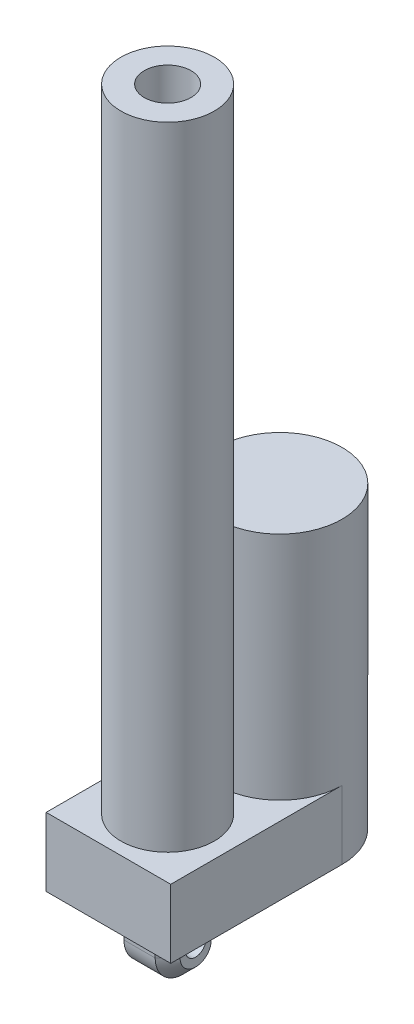
ISO-10303-21;
HEADER;
FILE_DESCRIPTION(('STEP AP214'),'2;1');
FILE_NAME('part.step','',(''),(''),'','','');
FILE_SCHEMA(('AUTOMOTIVE_DESIGN { 1 0 10303 214 1 1 1 1 }'));
ENDSEC;
DATA;
#1=APPLICATION_CONTEXT('core data for automotive mechanical design processes');
#2=APPLICATION_PROTOCOL_DEFINITION('international standard','automotive_design',2000,#1);
#3=PRODUCT_CONTEXT('',#1,'mechanical');
#4=PRODUCT('Part','Part','',(#3));
#5=PRODUCT_RELATED_PRODUCT_CATEGORY('part','',(#4));
#6=PRODUCT_DEFINITION_FORMATION('','',#4);
#7=PRODUCT_DEFINITION_CONTEXT('part definition',#1,'design');
#8=PRODUCT_DEFINITION('design','',#6,#7);
#9=PRODUCT_DEFINITION_SHAPE('','',#8);
#10=(LENGTH_UNIT() NAMED_UNIT(*) SI_UNIT(.MILLI.,.METRE.));
#11=(NAMED_UNIT(*) PLANE_ANGLE_UNIT() SI_UNIT($,.RADIAN.));
#12=(NAMED_UNIT(*) SI_UNIT($,.STERADIAN.) SOLID_ANGLE_UNIT());
#13=UNCERTAINTY_MEASURE_WITH_UNIT(LENGTH_MEASURE(1.E-05),#10,'distance_accuracy_value','');
#14=(GEOMETRIC_REPRESENTATION_CONTEXT(3) GLOBAL_UNCERTAINTY_ASSIGNED_CONTEXT((#13)) GLOBAL_UNIT_ASSIGNED_CONTEXT((#10,
#11,#12)) REPRESENTATION_CONTEXT('',''));
#15=CARTESIAN_POINT('',(0.,0.,0.));
#16=DIRECTION('',(0.,0.,1.));
#17=DIRECTION('',(1.,0.,0.));
#18=AXIS2_PLACEMENT_3D('',#15,#16,#17);
#19=CARTESIAN_POINT('',(-9.,-20.,-0.500000000000004));
#20=DIRECTION('',(0.,0.,1.));
#21=DIRECTION('',(1.,0.,0.));
#22=AXIS2_PLACEMENT_3D('',#19,#20,#21);
#23=PLANE('',#22);
#24=DIRECTION('',(1.,0.,0.));
#25=VECTOR('',#24,1.);
#26=CARTESIAN_POINT('',(-9.,0.,-0.500000000000004));
#27=LINE('',#26,#25);
#28=CARTESIAN_POINT('',(-5.00000000000002,0.,-0.500000000000004));
#29=VERTEX_POINT('',#28);
#30=CARTESIAN_POINT('',(5.,0.,-0.500000000000004));
#31=VERTEX_POINT('',#30);
#32=EDGE_CURVE('E285',#29,#31,#27,.T.);
#33=ORIENTED_EDGE('',*,*,#32,.T.);
#34=DIRECTION('',(0.,-1.,0.));
#35=VECTOR('',#34,1.);
#36=CARTESIAN_POINT('',(5.,-20.,-0.500000000000004));
#37=LINE('',#36,#35);
#38=CARTESIAN_POINT('',(5.,-11.,-0.500000000000004));
#39=VERTEX_POINT('',#38);
#40=EDGE_CURVE('E240',#31,#39,#37,.T.);
#41=ORIENTED_EDGE('',*,*,#40,.T.);
#42=DIRECTION('',(-1.,0.,0.));
#43=VECTOR('',#42,1.);
#44=CARTESIAN_POINT('',(20.,-11.,-0.500000000000004));
#45=LINE('',#44,#43);
#46=CARTESIAN_POINT('',(-5.00000000000002,-11.,-0.500000000000004));
#47=VERTEX_POINT('',#46);
#48=EDGE_CURVE('E273',#39,#47,#45,.T.);
#49=ORIENTED_EDGE('',*,*,#48,.T.);
#50=DIRECTION('',(0.,1.,0.));
#51=VECTOR('',#50,1.);
#52=CARTESIAN_POINT('',(-5.00000000000002,-20.,-0.500000000000004));
#53=LINE('',#52,#51);
#54=EDGE_CURVE('E163',#47,#29,#53,.T.);
#55=ORIENTED_EDGE('',*,*,#54,.T.);
#56=EDGE_LOOP('',(#33,#41,#49,#55));
#57=FACE_BOUND('',#56,.T.);
#58=ADVANCED_FACE('F41',(#57),#23,.F.);
#59=CARTESIAN_POINT('',(0.,0.,-27.5));
#60=DIRECTION('',(0.,1.,0.));
#61=DIRECTION('',(0.,0.,1.));
#62=AXIS2_PLACEMENT_3D('',#59,#60,#61);
#63=PLANE('',#62);
#64=CARTESIAN_POINT('',(0.,0.,-27.5));
#65=DIRECTION('',(0.,1.,0.));
#66=DIRECTION('',(0.,0.,1.));
#67=AXIS2_PLACEMENT_3D('',#64,#65,#66);
#68=CIRCLE('',#67,20.);
#69=CARTESIAN_POINT('',(20.,0.,-27.5));
#70=VERTEX_POINT('',#69);
#71=CARTESIAN_POINT('',(-20.,0.,-27.5));
#72=VERTEX_POINT('',#71);
#73=EDGE_CURVE('E181',#70,#72,#68,.T.);
#74=ORIENTED_EDGE('',*,*,#73,.F.);
#75=DIRECTION('',(0.,0.,-1.));
#76=VECTOR('',#75,1.);
#77=CARTESIAN_POINT('',(20.,0.,27.5));
#78=LINE('',#77,#76);
#79=CARTESIAN_POINT('',(20.,0.,27.5));
#80=VERTEX_POINT('',#79);
#81=EDGE_CURVE('E140',#80,#70,#78,.T.);
#82=ORIENTED_EDGE('',*,*,#81,.F.);
#83=DIRECTION('',(1.,0.,0.));
#84=VECTOR('',#83,1.);
#85=CARTESIAN_POINT('',(-20.,0.,27.5));
#86=LINE('',#85,#84);
#87=CARTESIAN_POINT('',(-20.,0.,27.5));
#88=VERTEX_POINT('',#87);
#89=EDGE_CURVE('E187',#88,#80,#86,.T.);
#90=ORIENTED_EDGE('',*,*,#89,.F.);
#91=DIRECTION('',(0.,0.,1.));
#92=VECTOR('',#91,1.);
#93=CARTESIAN_POINT('',(-20.,0.,27.5));
#94=LINE('',#93,#92);
#95=EDGE_CURVE('E184',#72,#88,#94,.T.);
#96=ORIENTED_EDGE('',*,*,#95,.F.);
#97=EDGE_LOOP('',(#74,#82,#90,#96));
#98=FACE_BOUND('',#97,.T.);
#99=DIRECTION('',(0.,0.,1.));
#100=VECTOR('',#99,1.);
#101=CARTESIAN_POINT('',(9.,0.,-0.500000000000004));
#102=LINE('',#101,#100);
#103=CARTESIAN_POINT('',(9.,0.,3.50000000000003));
#104=VERTEX_POINT('',#103);
#105=CARTESIAN_POINT('',(9.,0.,13.5));
#106=VERTEX_POINT('',#105);
#107=EDGE_CURVE('E267',#104,#106,#102,.T.);
#108=ORIENTED_EDGE('',*,*,#107,.F.);
#109=DIRECTION('',(0.707106781186545,0.,0.70710678118655));
#110=VECTOR('',#109,1.);
#111=CARTESIAN_POINT('',(-11.,0.,-16.5000000000001));
#112=LINE('',#111,#110);
#113=EDGE_CURVE('E52',#104,#31,#112,.F.);
#114=ORIENTED_EDGE('',*,*,#113,.T.);
#115=ORIENTED_EDGE('',*,*,#32,.F.);
#116=DIRECTION('',(0.707106781186548,0.,-0.707106781186548));
#117=VECTOR('',#116,1.);
#118=CARTESIAN_POINT('',(11.,0.,-16.5));
#119=LINE('',#118,#117);
#120=CARTESIAN_POINT('',(-9.,0.,3.49999999999997));
#121=VERTEX_POINT('',#120);
#122=EDGE_CURVE('E213',#29,#121,#119,.F.);
#123=ORIENTED_EDGE('',*,*,#122,.T.);
#124=DIRECTION('',(0.,0.,-1.));
#125=VECTOR('',#124,1.);
#126=CARTESIAN_POINT('',(-9.,0.,-0.500000000000004));
#127=LINE('',#126,#125);
#128=CARTESIAN_POINT('',(-9.,0.,13.5));
#129=VERTEX_POINT('',#128);
#130=EDGE_CURVE('E277',#129,#121,#127,.T.);
#131=ORIENTED_EDGE('',*,*,#130,.F.);
#132=DIRECTION('',(-0.707106781186548,0.,-0.707106781186548));
#133=VECTOR('',#132,1.);
#134=CARTESIAN_POINT('',(-25.,0.,-2.5));
#135=LINE('',#134,#133);
#136=CARTESIAN_POINT('',(-5.00000000000002,0.,17.5));
#137=VERTEX_POINT('',#136);
#138=EDGE_CURVE('E216',#129,#137,#135,.F.);
#139=ORIENTED_EDGE('',*,*,#138,.T.);
#140=DIRECTION('',(-1.,0.,0.));
#141=VECTOR('',#140,1.);
#142=CARTESIAN_POINT('',(-9.,0.,17.5));
#143=LINE('',#142,#141);
#144=CARTESIAN_POINT('',(5.,0.,17.5));
#145=VERTEX_POINT('',#144);
#146=EDGE_CURVE('E268',#145,#137,#143,.T.);
#147=ORIENTED_EDGE('',*,*,#146,.F.);
#148=DIRECTION('',(-0.707106781186545,0.,0.70710678118655));
#149=VECTOR('',#148,1.);
#150=CARTESIAN_POINT('',(25.,0.,-2.50000000000016));
#151=LINE('',#150,#149);
#152=EDGE_CURVE('E11',#145,#106,#151,.F.);
#153=ORIENTED_EDGE('',*,*,#152,.T.);
#154=EDGE_LOOP('',(#108,#114,#115,#123,#131,#139,#147,#153));
#155=FACE_BOUND('',#154,.T.);
#156=ADVANCED_FACE('F266',(#98,#155),#63,.F.);
#157=CARTESIAN_POINT('',(0.,22.,-27.5));
#158=DIRECTION('',(0.,-1.,0.));
#159=DIRECTION('',(0.,0.,-1.));
#160=AXIS2_PLACEMENT_3D('',#157,#158,#159);
#161=CYLINDRICAL_SURFACE('',#160,20.);
#162=ORIENTED_EDGE('',*,*,#73,.T.);
#163=DIRECTION('',(0.,-1.,0.));
#164=VECTOR('',#163,1.);
#165=CARTESIAN_POINT('',(-20.,22.,-27.5));
#166=LINE('',#165,#164);
#167=CARTESIAN_POINT('',(-20.,22.,-27.5));
#168=VERTEX_POINT('',#167);
#169=EDGE_CURVE('E161',#168,#72,#166,.T.);
#170=ORIENTED_EDGE('',*,*,#169,.F.);
#171=CARTESIAN_POINT('',(0.,22.,-27.5));
#172=DIRECTION('',(0.,1.,0.));
#173=DIRECTION('',(0.,0.,1.));
#174=AXIS2_PLACEMENT_3D('',#171,#172,#173);
#175=CIRCLE('',#174,20.);
#176=CARTESIAN_POINT('',(20.,22.,-27.5));
#177=VERTEX_POINT('',#176);
#178=EDGE_CURVE('E150',#168,#177,#175,.T.);
#179=ORIENTED_EDGE('',*,*,#178,.T.);
#180=DIRECTION('',(0.,-1.,0.));
#181=VECTOR('',#180,1.);
#182=CARTESIAN_POINT('',(20.,22.,-27.5));
#183=LINE('',#182,#181);
#184=EDGE_CURVE('E134',#177,#70,#183,.T.);
#185=ORIENTED_EDGE('',*,*,#184,.T.);
#186=EDGE_LOOP('',(#162,#170,#179,#185));
#187=FACE_BOUND('',#186,.T.);
#188=CARTESIAN_POINT('',(0.,96.,-27.5));
#189=DIRECTION('',(0.,1.,0.));
#190=DIRECTION('',(0.,0.,1.));
#191=AXIS2_PLACEMENT_3D('',#188,#189,#190);
#192=CIRCLE('',#191,20.);
#193=CARTESIAN_POINT('',(0.,96.,-7.5));
#194=VERTEX_POINT('',#193);
#195=EDGE_CURVE('E174',#194,#194,#192,.T.);
#196=ORIENTED_EDGE('',*,*,#195,.F.);
#197=EDGE_LOOP('',(#196));
#198=FACE_BOUND('',#197,.T.);
#199=ADVANCED_FACE('F158',(#187,#198),#161,.T.);
#200=CARTESIAN_POINT('',(-20.,22.,27.5));
#201=DIRECTION('',(1.,0.,0.));
#202=DIRECTION('',(0.,0.,-1.));
#203=AXIS2_PLACEMENT_3D('',#200,#201,#202);
#204=PLANE('',#203);
#205=ORIENTED_EDGE('',*,*,#95,.T.);
#206=DIRECTION('',(0.,-1.,0.));
#207=VECTOR('',#206,1.);
#208=CARTESIAN_POINT('',(-20.,22.,27.5));
#209=LINE('',#208,#207);
#210=CARTESIAN_POINT('',(-20.,22.,27.5));
#211=VERTEX_POINT('',#210);
#212=EDGE_CURVE('E170',#211,#88,#209,.T.);
#213=ORIENTED_EDGE('',*,*,#212,.F.);
#214=DIRECTION('',(0.,0.,1.));
#215=VECTOR('',#214,1.);
#216=CARTESIAN_POINT('',(-20.,22.,27.5));
#217=LINE('',#216,#215);
#218=EDGE_CURVE('E176',#168,#211,#217,.T.);
#219=ORIENTED_EDGE('',*,*,#218,.F.);
#220=ORIENTED_EDGE('',*,*,#169,.T.);
#221=EDGE_LOOP('',(#205,#213,#219,#220));
#222=FACE_BOUND('',#221,.T.);
#223=ADVANCED_FACE('F494',(#222),#204,.F.);
#224=CARTESIAN_POINT('',(-20.,22.,27.5));
#225=DIRECTION('',(0.,0.,-1.));
#226=DIRECTION('',(-1.,0.,0.));
#227=AXIS2_PLACEMENT_3D('',#224,#225,#226);
#228=PLANE('',#227);
#229=ORIENTED_EDGE('',*,*,#89,.T.);
#230=DIRECTION('',(0.,-1.,0.));
#231=VECTOR('',#230,1.);
#232=CARTESIAN_POINT('',(20.,22.,27.5));
#233=LINE('',#232,#231);
#234=CARTESIAN_POINT('',(20.,22.,27.5));
#235=VERTEX_POINT('',#234);
#236=EDGE_CURVE('E146',#235,#80,#233,.T.);
#237=ORIENTED_EDGE('',*,*,#236,.F.);
#238=DIRECTION('',(1.,0.,0.));
#239=VECTOR('',#238,1.);
#240=CARTESIAN_POINT('',(-20.,22.,27.5));
#241=LINE('',#240,#239);
#242=EDGE_CURVE('E153',#211,#235,#241,.T.);
#243=ORIENTED_EDGE('',*,*,#242,.F.);
#244=ORIENTED_EDGE('',*,*,#212,.T.);
#245=EDGE_LOOP('',(#229,#237,#243,#244));
#246=FACE_BOUND('',#245,.T.);
#247=ADVANCED_FACE('F316',(#246),#228,.F.);
#248=CARTESIAN_POINT('',(20.,22.,27.5));
#249=DIRECTION('',(-1.,0.,0.));
#250=DIRECTION('',(0.,0.,1.));
#251=AXIS2_PLACEMENT_3D('',#248,#249,#250);
#252=PLANE('',#251);
#253=ORIENTED_EDGE('',*,*,#81,.T.);
#254=ORIENTED_EDGE('',*,*,#184,.F.);
#255=DIRECTION('',(0.,0.,-1.));
#256=VECTOR('',#255,1.);
#257=CARTESIAN_POINT('',(20.,22.,27.5));
#258=LINE('',#257,#256);
#259=EDGE_CURVE('E138',#235,#177,#258,.T.);
#260=ORIENTED_EDGE('',*,*,#259,.F.);
#261=ORIENTED_EDGE('',*,*,#236,.T.);
#262=EDGE_LOOP('',(#253,#254,#260,#261));
#263=FACE_BOUND('',#262,.T.);
#264=ADVANCED_FACE('F136',(#263),#252,.F.);
#265=CARTESIAN_POINT('',(0.,22.,-27.5));
#266=DIRECTION('',(0.,1.,0.));
#267=DIRECTION('',(0.,0.,1.));
#268=AXIS2_PLACEMENT_3D('',#265,#266,#267);
#269=PLANE('',#268);
#270=CARTESIAN_POINT('',(0.,22.,8.5));
#271=DIRECTION('',(0.,1.,0.));
#272=DIRECTION('',(0.,0.,1.));
#273=AXIS2_PLACEMENT_3D('',#270,#271,#272);
#274=CIRCLE('',#273,15.);
#275=CARTESIAN_POINT('',(0.,22.,-6.5));
#276=VERTEX_POINT('',#275);
#277=EDGE_CURVE('E294',#276,#276,#274,.T.);
#278=ORIENTED_EDGE('',*,*,#277,.F.);
#279=EDGE_LOOP('',(#278));
#280=FACE_BOUND('',#279,.T.);
#281=ORIENTED_EDGE('',*,*,#178,.F.);
#282=ORIENTED_EDGE('',*,*,#218,.T.);
#283=ORIENTED_EDGE('',*,*,#242,.T.);
#284=ORIENTED_EDGE('',*,*,#259,.T.);
#285=EDGE_LOOP('',(#281,#282,#283,#284));
#286=FACE_BOUND('',#285,.T.);
#287=ADVANCED_FACE('F149',(#280,#286),#269,.T.);
#288=CARTESIAN_POINT('',(0.,96.,-27.5));
#289=DIRECTION('',(0.,1.,0.));
#290=DIRECTION('',(0.,0.,1.));
#291=AXIS2_PLACEMENT_3D('',#288,#289,#290);
#292=PLANE('',#291);
#293=ORIENTED_EDGE('',*,*,#195,.T.);
#294=EDGE_LOOP('',(#293));
#295=FACE_BOUND('',#294,.T.);
#296=ADVANCED_FACE('F308',(#295),#292,.T.);
#297=CARTESIAN_POINT('',(0.,225.,8.5));
#298=DIRECTION('',(0.,-1.,0.));
#299=DIRECTION('',(0.,0.,-1.));
#300=AXIS2_PLACEMENT_3D('',#297,#298,#299);
#301=CYLINDRICAL_SURFACE('',#300,15.);
#302=CARTESIAN_POINT('',(0.,225.,8.5));
#303=DIRECTION('',(0.,1.,0.));
#304=DIRECTION('',(0.,0.,1.));
#305=AXIS2_PLACEMENT_3D('',#302,#303,#304);
#306=CIRCLE('',#305,15.);
#307=CARTESIAN_POINT('',(0.,225.,-6.5));
#308=VERTEX_POINT('',#307);
#309=EDGE_CURVE('E298',#308,#308,#306,.T.);
#310=CARTESIAN_POINT('',(0.,225.,-6.5));
#311=CARTESIAN_POINT('',(0.,222.885416666667,-6.5));
#312=CARTESIAN_POINT('',(0.,220.770833333333,-6.5));
#313=CARTESIAN_POINT('',(0.,216.541666666667,-6.5));
#314=CARTESIAN_POINT('',(0.,214.427083333333,-6.5));
#315=CARTESIAN_POINT('',(0.,210.197916666667,-6.5));
#316=CARTESIAN_POINT('',(0.,208.083333333333,-6.5));
#317=CARTESIAN_POINT('',(0.,203.854166666667,-6.5));
#318=CARTESIAN_POINT('',(0.,201.739583333333,-6.5));
#319=CARTESIAN_POINT('',(0.,197.510416666667,-6.5));
#320=CARTESIAN_POINT('',(0.,195.395833333333,-6.5));
#321=CARTESIAN_POINT('',(0.,191.166666666667,-6.5));
#322=CARTESIAN_POINT('',(0.,189.052083333333,-6.5));
#323=CARTESIAN_POINT('',(0.,184.822916666667,-6.5));
#324=CARTESIAN_POINT('',(0.,182.708333333333,-6.5));
#325=CARTESIAN_POINT('',(0.,178.479166666667,-6.5));
#326=CARTESIAN_POINT('',(0.,176.364583333333,-6.5));
#327=CARTESIAN_POINT('',(0.,172.135416666667,-6.5));
#328=CARTESIAN_POINT('',(0.,170.020833333333,-6.5));
#329=CARTESIAN_POINT('',(0.,165.791666666667,-6.5));
#330=CARTESIAN_POINT('',(0.,163.677083333333,-6.5));
#331=CARTESIAN_POINT('',(0.,159.447916666667,-6.5));
#332=CARTESIAN_POINT('',(0.,157.333333333333,-6.5));
#333=CARTESIAN_POINT('',(0.,153.104166666667,-6.5));
#334=CARTESIAN_POINT('',(0.,150.989583333333,-6.5));
#335=CARTESIAN_POINT('',(0.,146.760416666667,-6.5));
#336=CARTESIAN_POINT('',(0.,144.645833333333,-6.5));
#337=CARTESIAN_POINT('',(0.,140.416666666667,-6.5));
#338=CARTESIAN_POINT('',(0.,138.302083333333,-6.5));
#339=CARTESIAN_POINT('',(0.,134.072916666667,-6.5));
#340=CARTESIAN_POINT('',(0.,131.958333333333,-6.5));
#341=CARTESIAN_POINT('',(0.,127.729166666667,-6.5));
#342=CARTESIAN_POINT('',(0.,125.614583333333,-6.5));
#343=CARTESIAN_POINT('',(0.,121.385416666667,-6.5));
#344=CARTESIAN_POINT('',(0.,119.270833333333,-6.5));
#345=CARTESIAN_POINT('',(0.,115.041666666667,-6.5));
#346=CARTESIAN_POINT('',(0.,112.927083333333,-6.5));
#347=CARTESIAN_POINT('',(0.,108.697916666667,-6.5));
#348=CARTESIAN_POINT('',(0.,106.583333333333,-6.5));
#349=CARTESIAN_POINT('',(0.,102.354166666667,-6.5));
#350=CARTESIAN_POINT('',(0.,100.239583333333,-6.5));
#351=CARTESIAN_POINT('',(0.,96.0104166666667,-6.5));
#352=CARTESIAN_POINT('',(0.,93.8958333333333,-6.5));
#353=CARTESIAN_POINT('',(0.,89.6666666666667,-6.5));
#354=CARTESIAN_POINT('',(0.,87.5520833333333,-6.5));
#355=CARTESIAN_POINT('',(0.,83.3229166666667,-6.5));
#356=CARTESIAN_POINT('',(0.,81.2083333333334,-6.5));
#357=CARTESIAN_POINT('',(0.,76.9791666666667,-6.5));
#358=CARTESIAN_POINT('',(0.,74.8645833333333,-6.5));
#359=CARTESIAN_POINT('',(0.,70.6354166666667,-6.5));
#360=CARTESIAN_POINT('',(0.,68.5208333333334,-6.5));
#361=CARTESIAN_POINT('',(0.,64.2916666666667,-6.5));
#362=CARTESIAN_POINT('',(0.,62.1770833333334,-6.5));
#363=CARTESIAN_POINT('',(0.,57.9479166666667,-6.5));
#364=CARTESIAN_POINT('',(0.,55.8333333333333,-6.5));
#365=CARTESIAN_POINT('',(0.,51.6041666666667,-6.5));
#366=CARTESIAN_POINT('',(0.,49.4895833333334,-6.5));
#367=CARTESIAN_POINT('',(0.,45.2604166666667,-6.5));
#368=CARTESIAN_POINT('',(0.,43.1458333333334,-6.5));
#369=CARTESIAN_POINT('',(0.,38.9166666666667,-6.5));
#370=CARTESIAN_POINT('',(0.,36.8020833333333,-6.5));
#371=CARTESIAN_POINT('',(0.,32.5729166666667,-6.5));
#372=CARTESIAN_POINT('',(0.,30.4583333333334,-6.5));
#373=CARTESIAN_POINT('',(0.,26.2291666666667,-6.5));
#374=CARTESIAN_POINT('',(0.,24.1145833333334,-6.5));
#375=CARTESIAN_POINT('',(0.,22.,-6.5));
#376=B_SPLINE_CURVE_WITH_KNOTS('',3,(#310,#311,#312,#313,#314,#315,#316,#317,#318,#319,#320,
#321,#322,#323,#324,#325,#326,#327,#328,#329,#330,#331,#332,#333,#334,#335,#336,#337,#338,#339,
#340,#341,#342,#343,#344,#345,#346,#347,#348,#349,#350,#351,#352,#353,#354,#355,#356,#357,#358,
#359,#360,#361,#362,#363,#364,#365,#366,#367,#368,#369,#370,#371,#372,#373,#374,#375),
.UNSPECIFIED.,.F.,.F.,(4,2,2,2,2,2,2,2,2,2,2,2,2,2,2,2,2,2,2,2,2,2,2,2,2,2,2,2,2,2,2,2,4),(0.,
6.34374999999998,12.6875,19.03125,25.375,31.71875,38.0625,44.40625,50.75,57.09375,63.4375,
69.78125,76.125,82.46875,88.8125,95.15625,101.5,107.84375,114.1875,120.53125,126.875,133.21875,
139.5625,145.90625,152.25,158.59375,164.9375,171.28125,177.625,183.96875,190.3125,196.65625,
203.),.UNSPECIFIED.);
#377=EDGE_CURVE('BSEAM305',#308,#276,#376,.T.);
#378=ORIENTED_EDGE('',*,*,#309,.F.);
#379=ORIENTED_EDGE('',*,*,#277,.T.);
#380=ORIENTED_EDGE('',*,*,#377,.T.);
#381=ORIENTED_EDGE('',*,*,#377,.F.);
#382=EDGE_LOOP('',(#378,#380,#379,#381));
#383=FACE_BOUND('',#382,.T.);
#384=ADVANCED_FACE('F305',(#383),#301,.T.);
#385=CARTESIAN_POINT('',(0.,225.,8.5));
#386=DIRECTION('',(0.,1.,0.));
#387=DIRECTION('',(0.,0.,1.));
#388=AXIS2_PLACEMENT_3D('',#385,#386,#387);
#389=PLANE('',#388);
#390=CARTESIAN_POINT('',(0.,225.,8.5));
#391=DIRECTION('',(0.,1.,0.));
#392=DIRECTION('',(0.,0.,1.));
#393=AXIS2_PLACEMENT_3D('',#390,#391,#392);
#394=CIRCLE('',#393,7.5);
#395=CARTESIAN_POINT('',(0.,225.,16.));
#396=VERTEX_POINT('',#395);
#397=EDGE_CURVE('E289',#396,#396,#394,.T.);
#398=ORIENTED_EDGE('',*,*,#397,.F.);
#399=EDGE_LOOP('',(#398));
#400=FACE_BOUND('',#399,.T.);
#401=ORIENTED_EDGE('',*,*,#309,.T.);
#402=EDGE_LOOP('',(#401));
#403=FACE_BOUND('',#402,.T.);
#404=ADVANCED_FACE('F347',(#400,#403),#389,.T.);
#405=CARTESIAN_POINT('',(0.,75.,8.5));
#406=DIRECTION('',(0.,1.,0.));
#407=DIRECTION('',(0.,0.,1.));
#408=AXIS2_PLACEMENT_3D('',#405,#406,#407);
#409=CYLINDRICAL_SURFACE('',#408,7.5);
#410=CARTESIAN_POINT('',(0.,75.,8.5));
#411=DIRECTION('',(0.,1.,0.));
#412=DIRECTION('',(0.,0.,1.));
#413=AXIS2_PLACEMENT_3D('',#410,#411,#412);
#414=CIRCLE('',#413,7.5);
#415=CARTESIAN_POINT('',(0.,75.,16.));
#416=VERTEX_POINT('',#415);
#417=EDGE_CURVE('E290',#416,#416,#414,.T.);
#418=ORIENTED_EDGE('',*,*,#417,.F.);
#419=EDGE_LOOP('',(#418));
#420=FACE_BOUND('',#419,.T.);
#421=ORIENTED_EDGE('',*,*,#397,.T.);
#422=EDGE_LOOP('',(#421));
#423=FACE_BOUND('',#422,.T.);
#424=ADVANCED_FACE('F343',(#420,#423),#409,.F.);
#425=CARTESIAN_POINT('',(0.,75.,8.5));
#426=DIRECTION('',(0.,1.,0.));
#427=DIRECTION('',(0.,0.,1.));
#428=AXIS2_PLACEMENT_3D('',#425,#426,#427);
#429=PLANE('',#428);
#430=ORIENTED_EDGE('',*,*,#417,.T.);
#431=EDGE_LOOP('',(#430));
#432=FACE_BOUND('',#431,.T.);
#433=ADVANCED_FACE('F339',(#432),#429,.T.);
#434=CARTESIAN_POINT('',(9.,-20.,-0.500000000000004));
#435=DIRECTION('',(-1.,0.,0.));
#436=DIRECTION('',(0.,0.,1.));
#437=AXIS2_PLACEMENT_3D('',#434,#435,#436);
#438=PLANE('',#437);
#439=CARTESIAN_POINT('',(9.,-10.,8.49999999999999));
#440=DIRECTION('',(-1.,0.,0.));
#441=DIRECTION('',(0.,0.,1.));
#442=AXIS2_PLACEMENT_3D('',#439,#440,#441);
#443=CIRCLE('',#442,3.25);
#444=CARTESIAN_POINT('',(9.,-10.,11.75));
#445=VERTEX_POINT('',#444);
#446=EDGE_CURVE('E252',#445,#445,#443,.T.);
#447=ORIENTED_EDGE('',*,*,#446,.T.);
#448=EDGE_LOOP('',(#447));
#449=FACE_BOUND('',#448,.T.);
#450=CARTESIAN_POINT('',(9.,-11.,8.49999999999999));
#451=DIRECTION('',(-1.,0.,0.));
#452=DIRECTION('',(0.,0.,1.));
#453=AXIS2_PLACEMENT_3D('',#450,#451,#452);
#454=CIRCLE('',#453,4.99999999999997);
#455=CARTESIAN_POINT('',(9.,-11.,13.5));
#456=VERTEX_POINT('',#455);
#457=CARTESIAN_POINT('',(9.,-11.,3.50000000000003));
#458=VERTEX_POINT('',#457);
#459=EDGE_CURVE('E233',#456,#458,#454,.F.);
#460=ORIENTED_EDGE('',*,*,#459,.T.);
#461=DIRECTION('',(0.,1.,0.));
#462=VECTOR('',#461,1.);
#463=CARTESIAN_POINT('',(9.,-20.,3.50000000000003));
#464=LINE('',#463,#462);
#465=EDGE_CURVE('E236',#458,#104,#464,.T.);
#466=ORIENTED_EDGE('',*,*,#465,.T.);
#467=ORIENTED_EDGE('',*,*,#107,.T.);
#468=DIRECTION('',(0.,-1.,0.));
#469=VECTOR('',#468,1.);
#470=CARTESIAN_POINT('',(9.,-20.,13.5));
#471=LINE('',#470,#469);
#472=EDGE_CURVE('E220',#106,#456,#471,.T.);
#473=ORIENTED_EDGE('',*,*,#472,.T.);
#474=EDGE_LOOP('',(#460,#466,#467,#473));
#475=FACE_BOUND('',#474,.T.);
#476=ADVANCED_FACE('F270',(#449,#475),#438,.F.);
#477=CARTESIAN_POINT('',(-9.,-20.,17.5));
#478=DIRECTION('',(0.,0.,-1.));
#479=DIRECTION('',(-1.,0.,0.));
#480=AXIS2_PLACEMENT_3D('',#477,#478,#479);
#481=PLANE('',#480);
#482=DIRECTION('',(-1.,0.,0.));
#483=VECTOR('',#482,1.);
#484=CARTESIAN_POINT('',(20.,-11.,17.5));
#485=LINE('',#484,#483);
#486=CARTESIAN_POINT('',(5.,-11.,17.5));
#487=VERTEX_POINT('',#486);
#488=CARTESIAN_POINT('',(-5.00000000000002,-11.,17.5));
#489=VERTEX_POINT('',#488);
#490=EDGE_CURVE('E230',#487,#489,#485,.T.);
#491=ORIENTED_EDGE('',*,*,#490,.F.);
#492=DIRECTION('',(0.,1.,0.));
#493=VECTOR('',#492,1.);
#494=CARTESIAN_POINT('',(5.,-20.,17.5));
#495=LINE('',#494,#493);
#496=EDGE_CURVE('E60',#487,#145,#495,.T.);
#497=ORIENTED_EDGE('',*,*,#496,.T.);
#498=ORIENTED_EDGE('',*,*,#146,.T.);
#499=DIRECTION('',(0.,-1.,0.));
#500=VECTOR('',#499,1.);
#501=CARTESIAN_POINT('',(-5.00000000000002,-20.,17.5));
#502=LINE('',#501,#500);
#503=EDGE_CURVE('E209',#137,#489,#502,.T.);
#504=ORIENTED_EDGE('',*,*,#503,.T.);
#505=EDGE_LOOP('',(#491,#497,#498,#504));
#506=FACE_BOUND('',#505,.T.);
#507=ADVANCED_FACE('F333',(#506),#481,.F.);
#508=CARTESIAN_POINT('',(-9.,-20.,-0.500000000000004));
#509=DIRECTION('',(1.,0.,0.));
#510=DIRECTION('',(0.,0.,-1.));
#511=AXIS2_PLACEMENT_3D('',#508,#509,#510);
#512=PLANE('',#511);
#513=CARTESIAN_POINT('',(-9.,-10.,8.49999999999999));
#514=DIRECTION('',(1.,0.,0.));
#515=DIRECTION('',(0.,0.,-1.));
#516=AXIS2_PLACEMENT_3D('',#513,#514,#515);
#517=CIRCLE('',#516,3.25);
#518=CARTESIAN_POINT('',(-9.,-10.,5.24999999999999));
#519=VERTEX_POINT('',#518);
#520=EDGE_CURVE('E46',#519,#519,#517,.T.);
#521=ORIENTED_EDGE('',*,*,#520,.T.);
#522=EDGE_LOOP('',(#521));
#523=FACE_BOUND('',#522,.T.);
#524=ORIENTED_EDGE('',*,*,#130,.T.);
#525=DIRECTION('',(0.,-1.,0.));
#526=VECTOR('',#525,1.);
#527=CARTESIAN_POINT('',(-9.,-20.,3.49999999999997));
#528=LINE('',#527,#526);
#529=CARTESIAN_POINT('',(-9.,-11.,3.49999999999997));
#530=VERTEX_POINT('',#529);
#531=EDGE_CURVE('E202',#121,#530,#528,.T.);
#532=ORIENTED_EDGE('',*,*,#531,.T.);
#533=CARTESIAN_POINT('',(-9.,-11.,8.49999999999999));
#534=DIRECTION('',(1.,0.,0.));
#535=DIRECTION('',(0.,0.,-1.));
#536=AXIS2_PLACEMENT_3D('',#533,#534,#535);
#537=CIRCLE('',#536,5.00000000000002);
#538=CARTESIAN_POINT('',(-9.,-11.,13.5));
#539=VERTEX_POINT('',#538);
#540=EDGE_CURVE('E199',#530,#539,#537,.F.);
#541=ORIENTED_EDGE('',*,*,#540,.T.);
#542=DIRECTION('',(0.,1.,0.));
#543=VECTOR('',#542,1.);
#544=CARTESIAN_POINT('',(-9.,-20.,13.5));
#545=LINE('',#544,#543);
#546=EDGE_CURVE('E168',#539,#129,#545,.T.);
#547=ORIENTED_EDGE('',*,*,#546,.T.);
#548=EDGE_LOOP('',(#524,#532,#541,#547));
#549=FACE_BOUND('',#548,.T.);
#550=ADVANCED_FACE('F330',(#523,#549),#512,.F.);
#551=CARTESIAN_POINT('',(20.,-11.,8.49999999999999));
#552=DIRECTION('',(-1.,0.,0.));
#553=DIRECTION('',(0.,0.,1.));
#554=AXIS2_PLACEMENT_3D('',#551,#552,#553);
#555=CYLINDRICAL_SURFACE('',#554,9.);
#556=ORIENTED_EDGE('',*,*,#48,.F.);
#557=CARTESIAN_POINT('',(5.,-11.,8.49999999999999));
#558=DIRECTION('',(-1.,0.,0.));
#559=DIRECTION('',(0.,0.,1.));
#560=AXIS2_PLACEMENT_3D('',#557,#558,#559);
#561=CIRCLE('',#560,9.);
#562=EDGE_CURVE('E68',#39,#487,#561,.T.);
#563=ORIENTED_EDGE('',*,*,#562,.T.);
#564=ORIENTED_EDGE('',*,*,#490,.T.);
#565=CARTESIAN_POINT('',(-5.00000000000002,-11.,8.49999999999999));
#566=DIRECTION('',(1.,0.,0.));
#567=DIRECTION('',(0.,0.,-1.));
#568=AXIS2_PLACEMENT_3D('',#565,#566,#567);
#569=CIRCLE('',#568,9.);
#570=EDGE_CURVE('E205',#489,#47,#569,.T.);
#571=ORIENTED_EDGE('',*,*,#570,.T.);
#572=EDGE_LOOP('',(#556,#563,#564,#571));
#573=FACE_BOUND('',#572,.T.);
#574=ADVANCED_FACE('F328',(#573),#555,.T.);
#575=CARTESIAN_POINT('',(-9.,-20.,13.5));
#576=DIRECTION('',(0.707106781186547,0.,-0.707106781186547));
#577=DIRECTION('',(0.,1.,0.));
#578=AXIS2_PLACEMENT_3D('',#575,#576,#577);
#579=PLANE('',#578);
#580=ORIENTED_EDGE('',*,*,#138,.F.);
#581=ORIENTED_EDGE('',*,*,#546,.F.);
#582=DIRECTION('',(-0.707106781186547,0.,-0.707106781186547));
#583=VECTOR('',#582,1.);
#584=CARTESIAN_POINT('',(-5.00000000000002,-11.,17.5));
#585=LINE('',#584,#583);
#586=EDGE_CURVE('E225',#489,#539,#585,.T.);
#587=ORIENTED_EDGE('',*,*,#586,.F.);
#588=ORIENTED_EDGE('',*,*,#503,.F.);
#589=EDGE_LOOP('',(#580,#581,#587,#588));
#590=FACE_BOUND('',#589,.T.);
#591=ADVANCED_FACE('F394',(#590),#579,.F.);
#592=CARTESIAN_POINT('',(-9.,-11.,8.49999999999999));
#593=DIRECTION('',(1.,0.,0.));
#594=DIRECTION('',(0.,0.,-1.));
#595=AXIS2_PLACEMENT_3D('',#592,#593,#594);
#596=CONICAL_SURFACE('',#595,5.00000000000002,0.785398163397448);
#597=ORIENTED_EDGE('',*,*,#586,.T.);
#598=ORIENTED_EDGE('',*,*,#540,.F.);
#599=DIRECTION('',(-0.707106781186547,0.,0.707106781186547));
#600=VECTOR('',#599,1.);
#601=CARTESIAN_POINT('',(-5.00000000000002,-11.,-0.500000000000006));
#602=LINE('',#601,#600);
#603=EDGE_CURVE('E221',#47,#530,#602,.T.);
#604=ORIENTED_EDGE('',*,*,#603,.F.);
#605=ORIENTED_EDGE('',*,*,#570,.F.);
#606=EDGE_LOOP('',(#597,#598,#604,#605));
#607=FACE_BOUND('',#606,.T.);
#608=ADVANCED_FACE('F400',(#607),#596,.T.);
#609=CARTESIAN_POINT('',(-5.00000000000002,-20.,-0.500000000000004));
#610=DIRECTION('',(0.707106781186547,0.,0.707106781186547));
#611=DIRECTION('',(0.,1.,0.));
#612=AXIS2_PLACEMENT_3D('',#609,#610,#611);
#613=PLANE('',#612);
#614=ORIENTED_EDGE('',*,*,#603,.T.);
#615=ORIENTED_EDGE('',*,*,#531,.F.);
#616=ORIENTED_EDGE('',*,*,#122,.F.);
#617=ORIENTED_EDGE('',*,*,#54,.F.);
#618=EDGE_LOOP('',(#614,#615,#616,#617));
#619=FACE_BOUND('',#618,.T.);
#620=ADVANCED_FACE('F408',(#619),#613,.F.);
#621=CARTESIAN_POINT('',(5.,-20.,17.5));
#622=DIRECTION('',(-0.70710678118655,0.,-0.707106781186545));
#623=DIRECTION('',(0.,1.,0.));
#624=AXIS2_PLACEMENT_3D('',#621,#622,#623);
#625=PLANE('',#624);
#626=ORIENTED_EDGE('',*,*,#152,.F.);
#627=ORIENTED_EDGE('',*,*,#496,.F.);
#628=DIRECTION('',(-0.707106781186545,0.,0.70710678118655));
#629=VECTOR('',#628,1.);
#630=CARTESIAN_POINT('',(9.,-11.,13.5));
#631=LINE('',#630,#629);
#632=EDGE_CURVE('E226',#456,#487,#631,.T.);
#633=ORIENTED_EDGE('',*,*,#632,.F.);
#634=ORIENTED_EDGE('',*,*,#472,.F.);
#635=EDGE_LOOP('',(#626,#627,#633,#634));
#636=FACE_BOUND('',#635,.T.);
#637=ADVANCED_FACE('F44',(#636),#625,.F.);
#638=CARTESIAN_POINT('',(9.,-11.,8.49999999999999));
#639=DIRECTION('',(-1.,0.,0.));
#640=DIRECTION('',(0.,0.,1.));
#641=AXIS2_PLACEMENT_3D('',#638,#639,#640);
#642=CONICAL_SURFACE('',#641,4.99999999999997,0.785398163397452);
#643=ORIENTED_EDGE('',*,*,#632,.T.);
#644=ORIENTED_EDGE('',*,*,#562,.F.);
#645=DIRECTION('',(-0.707106781186545,0.,-0.70710678118655));
#646=VECTOR('',#645,1.);
#647=CARTESIAN_POINT('',(9.,-11.,3.50000000000003));
#648=LINE('',#647,#646);
#649=EDGE_CURVE('E249',#458,#39,#648,.T.);
#650=ORIENTED_EDGE('',*,*,#649,.F.);
#651=ORIENTED_EDGE('',*,*,#459,.F.);
#652=EDGE_LOOP('',(#643,#644,#650,#651));
#653=FACE_BOUND('',#652,.T.);
#654=ADVANCED_FACE('F258',(#653),#642,.T.);
#655=CARTESIAN_POINT('',(9.,-20.,3.50000000000003));
#656=DIRECTION('',(-0.70710678118655,0.,0.707106781186545));
#657=DIRECTION('',(0.,1.,0.));
#658=AXIS2_PLACEMENT_3D('',#655,#656,#657);
#659=PLANE('',#658);
#660=ORIENTED_EDGE('',*,*,#649,.T.);
#661=ORIENTED_EDGE('',*,*,#40,.F.);
#662=ORIENTED_EDGE('',*,*,#113,.F.);
#663=ORIENTED_EDGE('',*,*,#465,.F.);
#664=EDGE_LOOP('',(#660,#661,#662,#663));
#665=FACE_BOUND('',#664,.T.);
#666=ADVANCED_FACE('F427',(#665),#659,.F.);
#667=CARTESIAN_POINT('',(-20.,-10.,8.49999999999999));
#668=DIRECTION('',(1.,0.,0.));
#669=DIRECTION('',(0.,0.,-1.));
#670=AXIS2_PLACEMENT_3D('',#667,#668,#669);
#671=CYLINDRICAL_SURFACE('',#670,3.25);
#672=ORIENTED_EDGE('',*,*,#520,.F.);
#673=EDGE_LOOP('',(#672));
#674=FACE_BOUND('',#673,.T.);
#675=ORIENTED_EDGE('',*,*,#446,.F.);
#676=EDGE_LOOP('',(#675));
#677=FACE_BOUND('',#676,.T.);
#678=ADVANCED_FACE('F432',(#674,#677),#671,.F.);
#679=CLOSED_SHELL('',(#58,#156,#199,#223,#247,#264,#287,#296,#384,#404,#424,#433,#476,#507,#550,
#574,#591,#608,#620,#637,#654,#666,#678));
#680=MANIFOLD_SOLID_BREP('B2',#679);
#681=ADVANCED_BREP_SHAPE_REPRESENTATION('',(#18,#680),#14);
#682=SHAPE_DEFINITION_REPRESENTATION(#9,#681);
ENDSEC;
END-ISO-10303-21;
